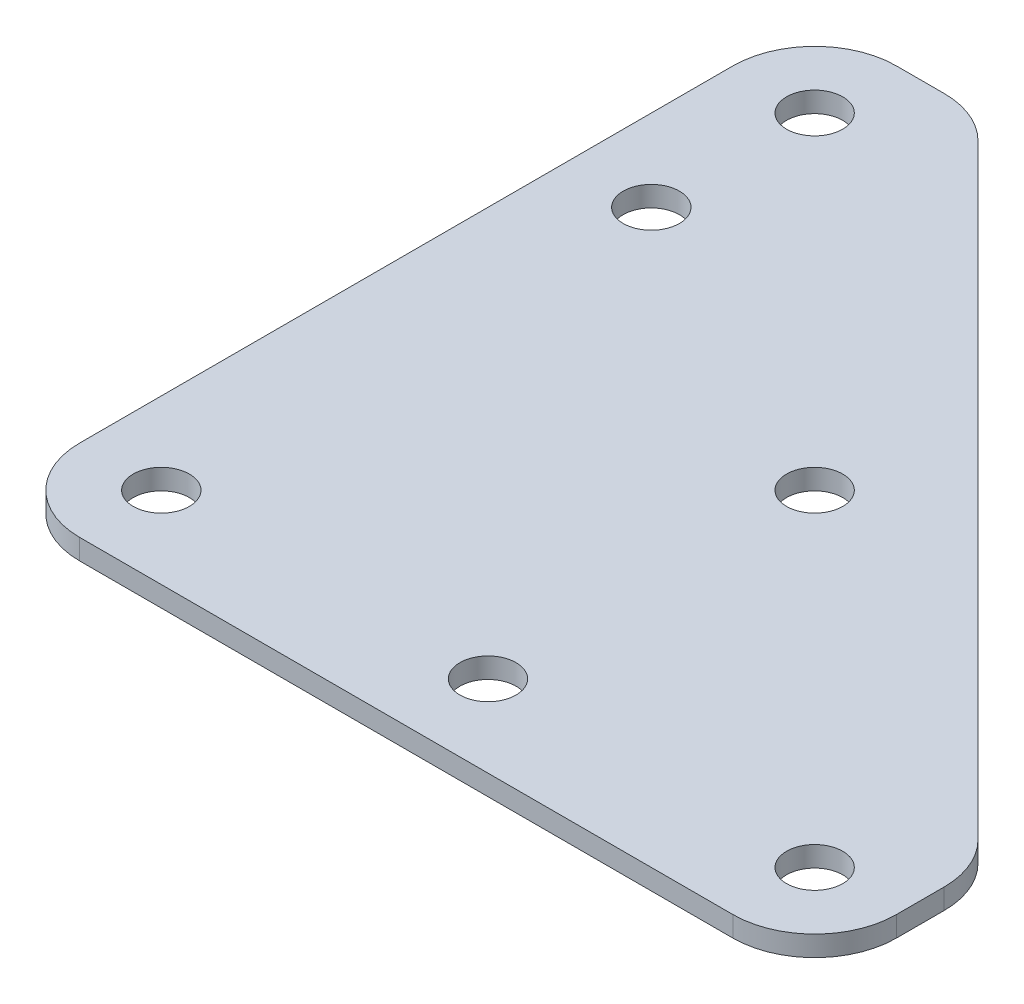
ISO-10303-21;
HEADER;
FILE_DESCRIPTION(('STEP AP214'),'2;1');
FILE_NAME('part.step','',(''),(''),'','','');
FILE_SCHEMA(('AUTOMOTIVE_DESIGN { 1 0 10303 214 1 1 1 1 }'));
ENDSEC;
DATA;
#1=APPLICATION_CONTEXT('core data for automotive mechanical design processes');
#2=APPLICATION_PROTOCOL_DEFINITION('international standard','automotive_design',2000,#1);
#3=PRODUCT_CONTEXT('',#1,'mechanical');
#4=PRODUCT('Part','Part','',(#3));
#5=PRODUCT_RELATED_PRODUCT_CATEGORY('part','',(#4));
#6=PRODUCT_DEFINITION_FORMATION('','',#4);
#7=PRODUCT_DEFINITION_CONTEXT('part definition',#1,'design');
#8=PRODUCT_DEFINITION('design','',#6,#7);
#9=PRODUCT_DEFINITION_SHAPE('','',#8);
#10=(LENGTH_UNIT() NAMED_UNIT(*) SI_UNIT(.MILLI.,.METRE.));
#11=(NAMED_UNIT(*) PLANE_ANGLE_UNIT() SI_UNIT($,.RADIAN.));
#12=(NAMED_UNIT(*) SI_UNIT($,.STERADIAN.) SOLID_ANGLE_UNIT());
#13=UNCERTAINTY_MEASURE_WITH_UNIT(LENGTH_MEASURE(1.E-05),#10,'distance_accuracy_value','');
#14=(GEOMETRIC_REPRESENTATION_CONTEXT(3) GLOBAL_UNCERTAINTY_ASSIGNED_CONTEXT((#13)) GLOBAL_UNIT_ASSIGNED_CONTEXT((#10,
#11,#12)) REPRESENTATION_CONTEXT('',''));
#15=CARTESIAN_POINT('',(0.,0.,0.));
#16=DIRECTION('',(0.,0.,1.));
#17=DIRECTION('',(1.,0.,0.));
#18=AXIS2_PLACEMENT_3D('',#15,#16,#17);
#19=CARTESIAN_POINT('',(50.8,0.79375,0.));
#20=DIRECTION('',(0.,-1.,0.));
#21=DIRECTION('',(0.,0.,-1.));
#22=AXIS2_PLACEMENT_3D('',#19,#20,#21);
#23=PLANE('',#22);
#24=CARTESIAN_POINT('',(50.8,0.79375,0.));
#25=DIRECTION('',(0.,1.,0.));
#26=DIRECTION('',(0.,0.,-1.));
#27=AXIS2_PLACEMENT_3D('',#24,#25,#26);
#28=CIRCLE('',#27,6.35);
#29=CARTESIAN_POINT('',(50.8,0.79375,6.34999999999999));
#30=VERTEX_POINT('',#29);
#31=CARTESIAN_POINT('',(57.15,0.79375,0.));
#32=VERTEX_POINT('',#31);
#33=EDGE_CURVE('E182',#30,#32,#28,.T.);
#34=ORIENTED_EDGE('',*,*,#33,.T.);
#35=DIRECTION('',(0.,0.,-1.));
#36=VECTOR('',#35,1.);
#37=CARTESIAN_POINT('',(57.15,0.79375,-3.71974387893083));
#38=LINE('',#37,#36);
#39=CARTESIAN_POINT('',(57.15,0.79375,-3.71974387893083));
#40=VERTEX_POINT('',#39);
#41=EDGE_CURVE('E106',#32,#40,#38,.T.);
#42=ORIENTED_EDGE('',*,*,#41,.T.);
#43=CARTESIAN_POINT('',(50.8,0.79375,-3.71974387893085));
#44=DIRECTION('',(0.,1.,0.));
#45=DIRECTION('',(0.,0.,-1.));
#46=AXIS2_PLACEMENT_3D('',#43,#44,#45);
#47=CIRCLE('',#46,6.35);
#48=CARTESIAN_POINT('',(55.2901280605346,0.79375,-8.20987193946545));
#49=VERTEX_POINT('',#48);
#50=EDGE_CURVE('E211',#40,#49,#47,.T.);
#51=ORIENTED_EDGE('',*,*,#50,.T.);
#52=DIRECTION('',(-0.707106781186548,0.,-0.707106781186547));
#53=VECTOR('',#52,1.);
#54=CARTESIAN_POINT('',(8.20987193946544,0.79375,-55.2901280605346));
#55=LINE('',#54,#53);
#56=CARTESIAN_POINT('',(8.20987193946544,0.79375,-55.2901280605346));
#57=VERTEX_POINT('',#56);
#58=EDGE_CURVE('E231',#49,#57,#55,.T.);
#59=ORIENTED_EDGE('',*,*,#58,.T.);
#60=CARTESIAN_POINT('',(3.71974387893085,0.79375,-50.8));
#61=DIRECTION('',(0.,1.,0.));
#62=DIRECTION('',(0.,0.,-1.));
#63=AXIS2_PLACEMENT_3D('',#60,#61,#62);
#64=CIRCLE('',#63,6.35);
#65=CARTESIAN_POINT('',(3.71974387893082,0.79375,-57.15));
#66=VERTEX_POINT('',#65);
#67=EDGE_CURVE('E227',#57,#66,#64,.T.);
#68=ORIENTED_EDGE('',*,*,#67,.T.);
#69=DIRECTION('',(-1.,0.,0.));
#70=VECTOR('',#69,1.);
#71=CARTESIAN_POINT('',(0.,0.79375,-57.15));
#72=LINE('',#71,#70);
#73=CARTESIAN_POINT('',(0.,0.79375,-57.15));
#74=VERTEX_POINT('',#73);
#75=EDGE_CURVE('E230',#66,#74,#72,.T.);
#76=ORIENTED_EDGE('',*,*,#75,.T.);
#77=CARTESIAN_POINT('',(0.,0.79375,-50.8));
#78=DIRECTION('',(0.,1.,0.));
#79=DIRECTION('',(0.,0.,-1.));
#80=AXIS2_PLACEMENT_3D('',#77,#78,#79);
#81=CIRCLE('',#80,6.35);
#82=CARTESIAN_POINT('',(-6.35,0.79375,-50.7999999999999));
#83=VERTEX_POINT('',#82);
#84=EDGE_CURVE('E131',#74,#83,#81,.T.);
#85=ORIENTED_EDGE('',*,*,#84,.T.);
#86=DIRECTION('',(0.,0.,1.));
#87=VECTOR('',#86,1.);
#88=CARTESIAN_POINT('',(-6.35,0.79375,0.));
#89=LINE('',#88,#87);
#90=CARTESIAN_POINT('',(-6.35,0.79375,0.));
#91=VERTEX_POINT('',#90);
#92=EDGE_CURVE('E125',#83,#91,#89,.T.);
#93=ORIENTED_EDGE('',*,*,#92,.T.);
#94=CARTESIAN_POINT('',(0.,0.79375,0.));
#95=DIRECTION('',(0.,1.,0.));
#96=DIRECTION('',(0.,0.,1.));
#97=AXIS2_PLACEMENT_3D('',#94,#95,#96);
#98=CIRCLE('',#97,6.35);
#99=CARTESIAN_POINT('',(0.,0.79375,6.35));
#100=VERTEX_POINT('',#99);
#101=EDGE_CURVE('E129',#91,#100,#98,.T.);
#102=ORIENTED_EDGE('',*,*,#101,.T.);
#103=DIRECTION('',(1.,0.,0.));
#104=VECTOR('',#103,1.);
#105=CARTESIAN_POINT('',(50.8,0.79375,6.34999999999999));
#106=LINE('',#105,#104);
#107=EDGE_CURVE('E57',#100,#30,#106,.T.);
#108=ORIENTED_EDGE('',*,*,#107,.T.);
#109=EDGE_LOOP('',(#34,#42,#51,#59,#68,#76,#85,#93,#102,#108));
#110=FACE_BOUND('',#109,.T.);
#111=CARTESIAN_POINT('',(0.,0.79375,0.));
#112=DIRECTION('',(0.,1.,0.));
#113=DIRECTION('',(0.,0.,1.));
#114=AXIS2_PLACEMENT_3D('',#111,#112,#113);
#115=CIRCLE('',#114,2.1828125);
#116=CARTESIAN_POINT('',(0.,0.79375,2.1828125));
#117=VERTEX_POINT('',#116);
#118=EDGE_CURVE('E158',#117,#117,#115,.T.);
#119=ORIENTED_EDGE('',*,*,#118,.F.);
#120=EDGE_LOOP('',(#119));
#121=FACE_BOUND('',#120,.T.);
#122=CARTESIAN_POINT('',(0.,0.79375,-50.8));
#123=DIRECTION('',(0.,1.,0.));
#124=DIRECTION('',(0.,0.,1.));
#125=AXIS2_PLACEMENT_3D('',#122,#123,#124);
#126=CIRCLE('',#125,2.1828125);
#127=CARTESIAN_POINT('',(0.,0.79375,-48.6171875));
#128=VERTEX_POINT('',#127);
#129=EDGE_CURVE('E249',#128,#128,#126,.T.);
#130=ORIENTED_EDGE('',*,*,#129,.F.);
#131=EDGE_LOOP('',(#130));
#132=FACE_BOUND('',#131,.T.);
#133=CARTESIAN_POINT('',(50.8,0.79375,0.));
#134=DIRECTION('',(0.,1.,0.));
#135=DIRECTION('',(0.,0.,1.));
#136=AXIS2_PLACEMENT_3D('',#133,#134,#135);
#137=CIRCLE('',#136,2.1828125);
#138=CARTESIAN_POINT('',(50.8,0.79375,2.1828125));
#139=VERTEX_POINT('',#138);
#140=EDGE_CURVE('E257',#139,#139,#137,.T.);
#141=ORIENTED_EDGE('',*,*,#140,.F.);
#142=EDGE_LOOP('',(#141));
#143=FACE_BOUND('',#142,.T.);
#144=CARTESIAN_POINT('',(0.,0.79375,-38.1));
#145=DIRECTION('',(0.,1.,0.));
#146=DIRECTION('',(0.,0.,1.));
#147=AXIS2_PLACEMENT_3D('',#144,#145,#146);
#148=CIRCLE('',#147,2.1828125);
#149=CARTESIAN_POINT('',(0.,0.79375,-35.9171875));
#150=VERTEX_POINT('',#149);
#151=EDGE_CURVE('E265',#150,#150,#148,.T.);
#152=ORIENTED_EDGE('',*,*,#151,.F.);
#153=EDGE_LOOP('',(#152));
#154=FACE_BOUND('',#153,.T.);
#155=CARTESIAN_POINT('',(25.4,0.79375,0.));
#156=DIRECTION('',(0.,1.,0.));
#157=DIRECTION('',(0.,0.,1.));
#158=AXIS2_PLACEMENT_3D('',#155,#156,#157);
#159=CIRCLE('',#158,2.1828125);
#160=CARTESIAN_POINT('',(25.4,0.79375,2.1828125));
#161=VERTEX_POINT('',#160);
#162=EDGE_CURVE('E273',#161,#161,#159,.T.);
#163=ORIENTED_EDGE('',*,*,#162,.F.);
#164=EDGE_LOOP('',(#163));
#165=FACE_BOUND('',#164,.T.);
#166=CARTESIAN_POINT('',(25.4,0.79375,-25.4));
#167=DIRECTION('',(0.,1.,0.));
#168=DIRECTION('',(0.,0.,1.));
#169=AXIS2_PLACEMENT_3D('',#166,#167,#168);
#170=CIRCLE('',#169,2.1828125);
#171=CARTESIAN_POINT('',(25.4,0.79375,-23.2171875));
#172=VERTEX_POINT('',#171);
#173=EDGE_CURVE('E281',#172,#172,#170,.T.);
#174=ORIENTED_EDGE('',*,*,#173,.F.);
#175=EDGE_LOOP('',(#174));
#176=FACE_BOUND('',#175,.T.);
#177=ADVANCED_FACE('F39',(#110,#121,#132,#143,#154,#165,#176),#23,.F.);
#178=CARTESIAN_POINT('',(50.8,-0.79375,0.));
#179=DIRECTION('',(0.,-1.,0.));
#180=DIRECTION('',(0.,0.,-1.));
#181=AXIS2_PLACEMENT_3D('',#178,#179,#180);
#182=PLANE('',#181);
#183=CARTESIAN_POINT('',(25.4,-0.79375,0.));
#184=DIRECTION('',(0.,1.,0.));
#185=DIRECTION('',(0.,0.,1.));
#186=AXIS2_PLACEMENT_3D('',#183,#184,#185);
#187=CIRCLE('',#186,2.1828125);
#188=CARTESIAN_POINT('',(25.4,-0.79375,2.1828125));
#189=VERTEX_POINT('',#188);
#190=EDGE_CURVE('E277',#189,#189,#187,.T.);
#191=ORIENTED_EDGE('',*,*,#190,.T.);
#192=EDGE_LOOP('',(#191));
#193=FACE_BOUND('',#192,.T.);
#194=CARTESIAN_POINT('',(50.8,-0.79375,0.));
#195=DIRECTION('',(0.,1.,0.));
#196=DIRECTION('',(0.,0.,1.));
#197=AXIS2_PLACEMENT_3D('',#194,#195,#196);
#198=CIRCLE('',#197,2.1828125);
#199=CARTESIAN_POINT('',(50.8,-0.79375,2.1828125));
#200=VERTEX_POINT('',#199);
#201=EDGE_CURVE('E261',#200,#200,#198,.T.);
#202=ORIENTED_EDGE('',*,*,#201,.T.);
#203=EDGE_LOOP('',(#202));
#204=FACE_BOUND('',#203,.T.);
#205=CARTESIAN_POINT('',(0.,-0.79375,0.));
#206=DIRECTION('',(0.,1.,0.));
#207=DIRECTION('',(0.,0.,1.));
#208=AXIS2_PLACEMENT_3D('',#205,#206,#207);
#209=CIRCLE('',#208,2.1828125);
#210=CARTESIAN_POINT('',(0.,-0.79375,2.1828125));
#211=VERTEX_POINT('',#210);
#212=EDGE_CURVE('E245',#211,#211,#209,.T.);
#213=ORIENTED_EDGE('',*,*,#212,.T.);
#214=EDGE_LOOP('',(#213));
#215=FACE_BOUND('',#214,.T.);
#216=CARTESIAN_POINT('',(50.8,-0.79375,0.));
#217=DIRECTION('',(0.,1.,0.));
#218=DIRECTION('',(0.,0.,-1.));
#219=AXIS2_PLACEMENT_3D('',#216,#217,#218);
#220=CIRCLE('',#219,6.35);
#221=CARTESIAN_POINT('',(50.8,-0.79375,6.34999999999999));
#222=VERTEX_POINT('',#221);
#223=CARTESIAN_POINT('',(57.15,-0.79375,0.));
#224=VERTEX_POINT('',#223);
#225=EDGE_CURVE('E153',#222,#224,#220,.T.);
#226=ORIENTED_EDGE('',*,*,#225,.F.);
#227=DIRECTION('',(1.,0.,0.));
#228=VECTOR('',#227,1.);
#229=CARTESIAN_POINT('',(50.8,-0.79375,6.34999999999999));
#230=LINE('',#229,#228);
#231=CARTESIAN_POINT('',(0.,-0.79375,6.35));
#232=VERTEX_POINT('',#231);
#233=EDGE_CURVE('E98',#232,#222,#230,.T.);
#234=ORIENTED_EDGE('',*,*,#233,.F.);
#235=CARTESIAN_POINT('',(0.,-0.79375,0.));
#236=DIRECTION('',(0.,1.,0.));
#237=DIRECTION('',(0.,0.,1.));
#238=AXIS2_PLACEMENT_3D('',#235,#236,#237);
#239=CIRCLE('',#238,6.35);
#240=CARTESIAN_POINT('',(-6.35,-0.79375,0.));
#241=VERTEX_POINT('',#240);
#242=EDGE_CURVE('E92',#241,#232,#239,.T.);
#243=ORIENTED_EDGE('',*,*,#242,.F.);
#244=DIRECTION('',(0.,0.,1.));
#245=VECTOR('',#244,1.);
#246=CARTESIAN_POINT('',(-6.35,-0.79375,0.));
#247=LINE('',#246,#245);
#248=CARTESIAN_POINT('',(-6.35,-0.79375,-50.7999999999999));
#249=VERTEX_POINT('',#248);
#250=EDGE_CURVE('E140',#249,#241,#247,.T.);
#251=ORIENTED_EDGE('',*,*,#250,.F.);
#252=CARTESIAN_POINT('',(0.,-0.79375,-50.8));
#253=DIRECTION('',(0.,1.,0.));
#254=DIRECTION('',(0.,0.,-1.));
#255=AXIS2_PLACEMENT_3D('',#252,#253,#254);
#256=CIRCLE('',#255,6.35);
#257=CARTESIAN_POINT('',(0.,-0.79375,-57.15));
#258=VERTEX_POINT('',#257);
#259=EDGE_CURVE('E173',#258,#249,#256,.T.);
#260=ORIENTED_EDGE('',*,*,#259,.F.);
#261=DIRECTION('',(-1.,0.,0.));
#262=VECTOR('',#261,1.);
#263=CARTESIAN_POINT('',(0.,-0.79375,-57.15));
#264=LINE('',#263,#262);
#265=CARTESIAN_POINT('',(3.71974387893082,-0.79375,-57.15));
#266=VERTEX_POINT('',#265);
#267=EDGE_CURVE('E170',#266,#258,#264,.T.);
#268=ORIENTED_EDGE('',*,*,#267,.F.);
#269=CARTESIAN_POINT('',(3.71974387893085,-0.79375,-50.8));
#270=DIRECTION('',(0.,1.,0.));
#271=DIRECTION('',(0.,0.,-1.));
#272=AXIS2_PLACEMENT_3D('',#269,#270,#271);
#273=CIRCLE('',#272,6.35);
#274=CARTESIAN_POINT('',(8.20987193946544,-0.79375,-55.2901280605346));
#275=VERTEX_POINT('',#274);
#276=EDGE_CURVE('E167',#275,#266,#273,.T.);
#277=ORIENTED_EDGE('',*,*,#276,.F.);
#278=DIRECTION('',(-0.707106781186548,0.,-0.707106781186547));
#279=VECTOR('',#278,1.);
#280=CARTESIAN_POINT('',(8.20987193946544,-0.79375,-55.2901280605346));
#281=LINE('',#280,#279);
#282=CARTESIAN_POINT('',(55.2901280605346,-0.79375,-8.20987193946545));
#283=VERTEX_POINT('',#282);
#284=EDGE_CURVE('E164',#283,#275,#281,.T.);
#285=ORIENTED_EDGE('',*,*,#284,.F.);
#286=CARTESIAN_POINT('',(50.8,-0.79375,-3.71974387893085));
#287=DIRECTION('',(0.,1.,0.));
#288=DIRECTION('',(0.,0.,-1.));
#289=AXIS2_PLACEMENT_3D('',#286,#287,#288);
#290=CIRCLE('',#289,6.35);
#291=CARTESIAN_POINT('',(57.15,-0.79375,-3.71974387893083));
#292=VERTEX_POINT('',#291);
#293=EDGE_CURVE('E161',#292,#283,#290,.T.);
#294=ORIENTED_EDGE('',*,*,#293,.F.);
#295=DIRECTION('',(0.,0.,-1.));
#296=VECTOR('',#295,1.);
#297=CARTESIAN_POINT('',(57.15,-0.79375,-3.71974387893083));
#298=LINE('',#297,#296);
#299=EDGE_CURVE('E157',#224,#292,#298,.T.);
#300=ORIENTED_EDGE('',*,*,#299,.F.);
#301=EDGE_LOOP('',(#226,#234,#243,#251,#260,#268,#277,#285,#294,#300));
#302=FACE_BOUND('',#301,.T.);
#303=CARTESIAN_POINT('',(0.,-0.79375,-50.8));
#304=DIRECTION('',(0.,1.,0.));
#305=DIRECTION('',(0.,0.,1.));
#306=AXIS2_PLACEMENT_3D('',#303,#304,#305);
#307=CIRCLE('',#306,2.1828125);
#308=CARTESIAN_POINT('',(0.,-0.79375,-48.6171875));
#309=VERTEX_POINT('',#308);
#310=EDGE_CURVE('E253',#309,#309,#307,.T.);
#311=ORIENTED_EDGE('',*,*,#310,.T.);
#312=EDGE_LOOP('',(#311));
#313=FACE_BOUND('',#312,.T.);
#314=CARTESIAN_POINT('',(0.,-0.79375,-38.1));
#315=DIRECTION('',(0.,1.,0.));
#316=DIRECTION('',(0.,0.,1.));
#317=AXIS2_PLACEMENT_3D('',#314,#315,#316);
#318=CIRCLE('',#317,2.1828125);
#319=CARTESIAN_POINT('',(0.,-0.79375,-35.9171875));
#320=VERTEX_POINT('',#319);
#321=EDGE_CURVE('E269',#320,#320,#318,.T.);
#322=ORIENTED_EDGE('',*,*,#321,.T.);
#323=EDGE_LOOP('',(#322));
#324=FACE_BOUND('',#323,.T.);
#325=CARTESIAN_POINT('',(25.4,-0.79375,-25.4));
#326=DIRECTION('',(0.,1.,0.));
#327=DIRECTION('',(0.,0.,1.));
#328=AXIS2_PLACEMENT_3D('',#325,#326,#327);
#329=CIRCLE('',#328,2.1828125);
#330=CARTESIAN_POINT('',(25.4,-0.79375,-23.2171875));
#331=VERTEX_POINT('',#330);
#332=EDGE_CURVE('E285',#331,#331,#329,.T.);
#333=ORIENTED_EDGE('',*,*,#332,.T.);
#334=EDGE_LOOP('',(#333));
#335=FACE_BOUND('',#334,.T.);
#336=ADVANCED_FACE('F215',(#193,#204,#215,#302,#313,#324,#335),#182,.T.);
#337=CARTESIAN_POINT('',(50.8,0.79375,0.));
#338=DIRECTION('',(0.,-1.,0.));
#339=DIRECTION('',(0.,0.,-1.));
#340=AXIS2_PLACEMENT_3D('',#337,#338,#339);
#341=CYLINDRICAL_SURFACE('',#340,6.35);
#342=ORIENTED_EDGE('',*,*,#225,.T.);
#343=DIRECTION('',(0.,-1.,0.));
#344=VECTOR('',#343,1.);
#345=CARTESIAN_POINT('',(57.15,0.79375,0.));
#346=LINE('',#345,#344);
#347=EDGE_CURVE('E11',#32,#224,#346,.T.);
#348=ORIENTED_EDGE('',*,*,#347,.F.);
#349=ORIENTED_EDGE('',*,*,#33,.F.);
#350=DIRECTION('',(0.,-1.,0.));
#351=VECTOR('',#350,1.);
#352=CARTESIAN_POINT('',(50.8,0.79375,6.34999999999999));
#353=LINE('',#352,#351);
#354=EDGE_CURVE('E149',#30,#222,#353,.T.);
#355=ORIENTED_EDGE('',*,*,#354,.T.);
#356=EDGE_LOOP('',(#342,#348,#349,#355));
#357=FACE_BOUND('',#356,.T.);
#358=ADVANCED_FACE('F41',(#357),#341,.T.);
#359=CARTESIAN_POINT('',(57.15,0.79375,-3.71974387893083));
#360=DIRECTION('',(-1.,0.,0.));
#361=DIRECTION('',(0.,0.,1.));
#362=AXIS2_PLACEMENT_3D('',#359,#360,#361);
#363=PLANE('',#362);
#364=ORIENTED_EDGE('',*,*,#299,.T.);
#365=DIRECTION('',(0.,-1.,0.));
#366=VECTOR('',#365,1.);
#367=CARTESIAN_POINT('',(57.15,0.79375,-3.71974387893083));
#368=LINE('',#367,#366);
#369=EDGE_CURVE('E49',#40,#292,#368,.T.);
#370=ORIENTED_EDGE('',*,*,#369,.F.);
#371=ORIENTED_EDGE('',*,*,#41,.F.);
#372=ORIENTED_EDGE('',*,*,#347,.T.);
#373=EDGE_LOOP('',(#364,#370,#371,#372));
#374=FACE_BOUND('',#373,.T.);
#375=ADVANCED_FACE('F327',(#374),#363,.F.);
#376=CARTESIAN_POINT('',(50.8,0.79375,-3.71974387893085));
#377=DIRECTION('',(0.,-1.,0.));
#378=DIRECTION('',(0.,0.,-1.));
#379=AXIS2_PLACEMENT_3D('',#376,#377,#378);
#380=CYLINDRICAL_SURFACE('',#379,6.35);
#381=ORIENTED_EDGE('',*,*,#293,.T.);
#382=DIRECTION('',(0.,-1.,0.));
#383=VECTOR('',#382,1.);
#384=CARTESIAN_POINT('',(55.2901280605346,0.79375,-8.20987193946545));
#385=LINE('',#384,#383);
#386=EDGE_CURVE('E201',#49,#283,#385,.T.);
#387=ORIENTED_EDGE('',*,*,#386,.F.);
#388=ORIENTED_EDGE('',*,*,#50,.F.);
#389=ORIENTED_EDGE('',*,*,#369,.T.);
#390=EDGE_LOOP('',(#381,#387,#388,#389));
#391=FACE_BOUND('',#390,.T.);
#392=ADVANCED_FACE('F209',(#391),#380,.T.);
#393=CARTESIAN_POINT('',(8.20987193946544,0.79375,-55.2901280605346));
#394=DIRECTION('',(-0.707106781186547,0.,0.707106781186548));
#395=DIRECTION('',(0.707106781186548,0.,0.707106781186547));
#396=AXIS2_PLACEMENT_3D('',#393,#394,#395);
#397=PLANE('',#396);
#398=ORIENTED_EDGE('',*,*,#284,.T.);
#399=DIRECTION('',(0.,-1.,0.));
#400=VECTOR('',#399,1.);
#401=CARTESIAN_POINT('',(8.20987193946544,0.79375,-55.2901280605346));
#402=LINE('',#401,#400);
#403=EDGE_CURVE('E197',#57,#275,#402,.T.);
#404=ORIENTED_EDGE('',*,*,#403,.F.);
#405=ORIENTED_EDGE('',*,*,#58,.F.);
#406=ORIENTED_EDGE('',*,*,#386,.T.);
#407=EDGE_LOOP('',(#398,#404,#405,#406));
#408=FACE_BOUND('',#407,.T.);
#409=ADVANCED_FACE('F221',(#408),#397,.F.);
#410=CARTESIAN_POINT('',(3.71974387893085,0.79375,-50.8));
#411=DIRECTION('',(0.,-1.,0.));
#412=DIRECTION('',(0.,0.,-1.));
#413=AXIS2_PLACEMENT_3D('',#410,#411,#412);
#414=CYLINDRICAL_SURFACE('',#413,6.35);
#415=ORIENTED_EDGE('',*,*,#276,.T.);
#416=DIRECTION('',(0.,-1.,0.));
#417=VECTOR('',#416,1.);
#418=CARTESIAN_POINT('',(3.71974387893082,0.79375,-57.15));
#419=LINE('',#418,#417);
#420=EDGE_CURVE('E193',#66,#266,#419,.T.);
#421=ORIENTED_EDGE('',*,*,#420,.F.);
#422=ORIENTED_EDGE('',*,*,#67,.F.);
#423=ORIENTED_EDGE('',*,*,#403,.T.);
#424=EDGE_LOOP('',(#415,#421,#422,#423));
#425=FACE_BOUND('',#424,.T.);
#426=ADVANCED_FACE('F225',(#425),#414,.T.);
#427=CARTESIAN_POINT('',(0.,0.79375,-57.15));
#428=DIRECTION('',(0.,0.,1.));
#429=DIRECTION('',(1.,0.,0.));
#430=AXIS2_PLACEMENT_3D('',#427,#428,#429);
#431=PLANE('',#430);
#432=ORIENTED_EDGE('',*,*,#267,.T.);
#433=DIRECTION('',(0.,-1.,0.));
#434=VECTOR('',#433,1.);
#435=CARTESIAN_POINT('',(0.,0.79375,-57.15));
#436=LINE('',#435,#434);
#437=EDGE_CURVE('E189',#74,#258,#436,.T.);
#438=ORIENTED_EDGE('',*,*,#437,.F.);
#439=ORIENTED_EDGE('',*,*,#75,.F.);
#440=ORIENTED_EDGE('',*,*,#420,.T.);
#441=EDGE_LOOP('',(#432,#438,#439,#440));
#442=FACE_BOUND('',#441,.T.);
#443=ADVANCED_FACE('F317',(#442),#431,.F.);
#444=CARTESIAN_POINT('',(0.,0.79375,-50.8));
#445=DIRECTION('',(0.,-1.,0.));
#446=DIRECTION('',(0.,0.,-1.));
#447=AXIS2_PLACEMENT_3D('',#444,#445,#446);
#448=CYLINDRICAL_SURFACE('',#447,6.35);
#449=ORIENTED_EDGE('',*,*,#259,.T.);
#450=DIRECTION('',(0.,-1.,0.));
#451=VECTOR('',#450,1.);
#452=CARTESIAN_POINT('',(-6.35,0.79375,-50.7999999999999));
#453=LINE('',#452,#451);
#454=EDGE_CURVE('E142',#83,#249,#453,.T.);
#455=ORIENTED_EDGE('',*,*,#454,.F.);
#456=ORIENTED_EDGE('',*,*,#84,.F.);
#457=ORIENTED_EDGE('',*,*,#437,.T.);
#458=EDGE_LOOP('',(#449,#455,#456,#457));
#459=FACE_BOUND('',#458,.T.);
#460=ADVANCED_FACE('F314',(#459),#448,.T.);
#461=CARTESIAN_POINT('',(-6.35,0.79375,0.));
#462=DIRECTION('',(1.,0.,0.));
#463=DIRECTION('',(0.,0.,-1.));
#464=AXIS2_PLACEMENT_3D('',#461,#462,#463);
#465=PLANE('',#464);
#466=ORIENTED_EDGE('',*,*,#250,.T.);
#467=DIRECTION('',(0.,-1.,0.));
#468=VECTOR('',#467,1.);
#469=CARTESIAN_POINT('',(-6.35,0.79375,0.));
#470=LINE('',#469,#468);
#471=EDGE_CURVE('E137',#91,#241,#470,.T.);
#472=ORIENTED_EDGE('',*,*,#471,.F.);
#473=ORIENTED_EDGE('',*,*,#92,.F.);
#474=ORIENTED_EDGE('',*,*,#454,.T.);
#475=EDGE_LOOP('',(#466,#472,#473,#474));
#476=FACE_BOUND('',#475,.T.);
#477=ADVANCED_FACE('F138',(#476),#465,.F.);
#478=CARTESIAN_POINT('',(0.,0.79375,0.));
#479=DIRECTION('',(0.,-1.,0.));
#480=DIRECTION('',(0.,0.,-1.));
#481=AXIS2_PLACEMENT_3D('',#478,#479,#480);
#482=CYLINDRICAL_SURFACE('',#481,6.35);
#483=ORIENTED_EDGE('',*,*,#242,.T.);
#484=DIRECTION('',(0.,-1.,0.));
#485=VECTOR('',#484,1.);
#486=CARTESIAN_POINT('',(0.,0.79375,6.35));
#487=LINE('',#486,#485);
#488=EDGE_CURVE('E143',#100,#232,#487,.T.);
#489=ORIENTED_EDGE('',*,*,#488,.F.);
#490=ORIENTED_EDGE('',*,*,#101,.F.);
#491=ORIENTED_EDGE('',*,*,#471,.T.);
#492=EDGE_LOOP('',(#483,#489,#490,#491));
#493=FACE_BOUND('',#492,.T.);
#494=ADVANCED_FACE('F145',(#493),#482,.T.);
#495=CARTESIAN_POINT('',(50.8,0.79375,6.34999999999999));
#496=DIRECTION('',(0.,0.,-1.));
#497=DIRECTION('',(-1.,0.,0.));
#498=AXIS2_PLACEMENT_3D('',#495,#496,#497);
#499=PLANE('',#498);
#500=ORIENTED_EDGE('',*,*,#233,.T.);
#501=ORIENTED_EDGE('',*,*,#354,.F.);
#502=ORIENTED_EDGE('',*,*,#107,.F.);
#503=ORIENTED_EDGE('',*,*,#488,.T.);
#504=EDGE_LOOP('',(#500,#501,#502,#503));
#505=FACE_BOUND('',#504,.T.);
#506=ADVANCED_FACE('F307',(#505),#499,.F.);
#507=CARTESIAN_POINT('',(0.,0.79375,0.));
#508=DIRECTION('',(0.,-1.,0.));
#509=DIRECTION('',(0.,0.,-1.));
#510=AXIS2_PLACEMENT_3D('',#507,#508,#509);
#511=CYLINDRICAL_SURFACE('',#510,2.1828125);
#512=ORIENTED_EDGE('',*,*,#118,.T.);
#513=EDGE_LOOP('',(#512));
#514=FACE_BOUND('',#513,.T.);
#515=ORIENTED_EDGE('',*,*,#212,.F.);
#516=EDGE_LOOP('',(#515));
#517=FACE_BOUND('',#516,.T.);
#518=ADVANCED_FACE('F304',(#514,#517),#511,.F.);
#519=CARTESIAN_POINT('',(0.,0.79375,-50.8));
#520=DIRECTION('',(0.,-1.,0.));
#521=DIRECTION('',(0.,0.,-1.));
#522=AXIS2_PLACEMENT_3D('',#519,#520,#521);
#523=CYLINDRICAL_SURFACE('',#522,2.1828125);
#524=ORIENTED_EDGE('',*,*,#129,.T.);
#525=EDGE_LOOP('',(#524));
#526=FACE_BOUND('',#525,.T.);
#527=ORIENTED_EDGE('',*,*,#310,.F.);
#528=EDGE_LOOP('',(#527));
#529=FACE_BOUND('',#528,.T.);
#530=ADVANCED_FACE('F403',(#526,#529),#523,.F.);
#531=CARTESIAN_POINT('',(50.8,0.79375,0.));
#532=DIRECTION('',(0.,-1.,0.));
#533=DIRECTION('',(0.,0.,-1.));
#534=AXIS2_PLACEMENT_3D('',#531,#532,#533);
#535=CYLINDRICAL_SURFACE('',#534,2.1828125);
#536=ORIENTED_EDGE('',*,*,#140,.T.);
#537=EDGE_LOOP('',(#536));
#538=FACE_BOUND('',#537,.T.);
#539=ORIENTED_EDGE('',*,*,#201,.F.);
#540=EDGE_LOOP('',(#539));
#541=FACE_BOUND('',#540,.T.);
#542=ADVANCED_FACE('F411',(#538,#541),#535,.F.);
#543=CARTESIAN_POINT('',(0.,0.79375,-38.1));
#544=DIRECTION('',(0.,-1.,0.));
#545=DIRECTION('',(0.,0.,-1.));
#546=AXIS2_PLACEMENT_3D('',#543,#544,#545);
#547=CYLINDRICAL_SURFACE('',#546,2.1828125);
#548=ORIENTED_EDGE('',*,*,#151,.T.);
#549=EDGE_LOOP('',(#548));
#550=FACE_BOUND('',#549,.T.);
#551=ORIENTED_EDGE('',*,*,#321,.F.);
#552=EDGE_LOOP('',(#551));
#553=FACE_BOUND('',#552,.T.);
#554=ADVANCED_FACE('F419',(#550,#553),#547,.F.);
#555=CARTESIAN_POINT('',(25.4,0.79375,0.));
#556=DIRECTION('',(0.,-1.,0.));
#557=DIRECTION('',(0.,0.,-1.));
#558=AXIS2_PLACEMENT_3D('',#555,#556,#557);
#559=CYLINDRICAL_SURFACE('',#558,2.1828125);
#560=ORIENTED_EDGE('',*,*,#162,.T.);
#561=EDGE_LOOP('',(#560));
#562=FACE_BOUND('',#561,.T.);
#563=ORIENTED_EDGE('',*,*,#190,.F.);
#564=EDGE_LOOP('',(#563));
#565=FACE_BOUND('',#564,.T.);
#566=ADVANCED_FACE('F428',(#562,#565),#559,.F.);
#567=CARTESIAN_POINT('',(25.4,0.79375,-25.4));
#568=DIRECTION('',(0.,-1.,0.));
#569=DIRECTION('',(0.,0.,-1.));
#570=AXIS2_PLACEMENT_3D('',#567,#568,#569);
#571=CYLINDRICAL_SURFACE('',#570,2.1828125);
#572=ORIENTED_EDGE('',*,*,#173,.T.);
#573=EDGE_LOOP('',(#572));
#574=FACE_BOUND('',#573,.T.);
#575=ORIENTED_EDGE('',*,*,#332,.F.);
#576=EDGE_LOOP('',(#575));
#577=FACE_BOUND('',#576,.T.);
#578=ADVANCED_FACE('F293',(#574,#577),#571,.F.);
#579=CLOSED_SHELL('',(#177,#336,#358,#375,#392,#409,#426,#443,#460,#477,#494,#506,#518,#530,
#542,#554,#566,#578));
#580=MANIFOLD_SOLID_BREP('B2',#579);
#581=ADVANCED_BREP_SHAPE_REPRESENTATION('',(#18,#580),#14);
#582=SHAPE_DEFINITION_REPRESENTATION(#9,#581);
ENDSEC;
END-ISO-10303-21;
